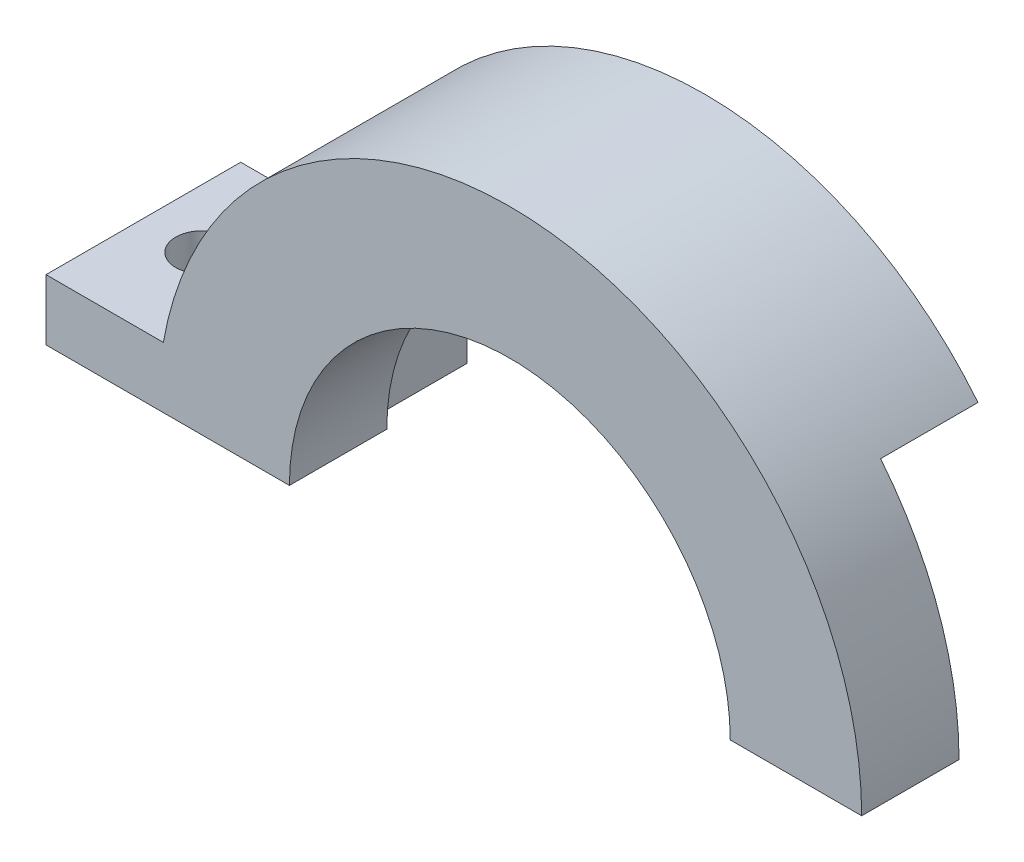
ISO-10303-21;
HEADER;
FILE_DESCRIPTION(('STEP AP214'),'2;1');
FILE_NAME('part.step','',(''),(''),'','','');
FILE_SCHEMA(('AUTOMOTIVE_DESIGN { 1 0 10303 214 1 1 1 1 }'));
ENDSEC;
DATA;
#1=APPLICATION_CONTEXT('core data for automotive mechanical design processes');
#2=APPLICATION_PROTOCOL_DEFINITION('international standard','automotive_design',2000,#1);
#3=PRODUCT_CONTEXT('',#1,'mechanical');
#4=PRODUCT('Part','Part','',(#3));
#5=PRODUCT_RELATED_PRODUCT_CATEGORY('part','',(#4));
#6=PRODUCT_DEFINITION_FORMATION('','',#4);
#7=PRODUCT_DEFINITION_CONTEXT('part definition',#1,'design');
#8=PRODUCT_DEFINITION('design','',#6,#7);
#9=PRODUCT_DEFINITION_SHAPE('','',#8);
#10=(LENGTH_UNIT() NAMED_UNIT(*) SI_UNIT(.MILLI.,.METRE.));
#11=(NAMED_UNIT(*) PLANE_ANGLE_UNIT() SI_UNIT($,.RADIAN.));
#12=(NAMED_UNIT(*) SI_UNIT($,.STERADIAN.) SOLID_ANGLE_UNIT());
#13=UNCERTAINTY_MEASURE_WITH_UNIT(LENGTH_MEASURE(1.E-05),#10,'distance_accuracy_value','');
#14=(GEOMETRIC_REPRESENTATION_CONTEXT(3) GLOBAL_UNCERTAINTY_ASSIGNED_CONTEXT((#13)) GLOBAL_UNIT_ASSIGNED_CONTEXT((#10,
#11,#12)) REPRESENTATION_CONTEXT('',''));
#15=CARTESIAN_POINT('',(0.,0.,0.));
#16=DIRECTION('',(0.,0.,1.));
#17=DIRECTION('',(1.,0.,0.));
#18=AXIS2_PLACEMENT_3D('',#15,#16,#17);
#19=CARTESIAN_POINT('',(0.,0.,8.));
#20=DIRECTION('',(0.,0.,-1.));
#21=DIRECTION('',(-1.,0.,0.));
#22=AXIS2_PLACEMENT_3D('',#19,#20,#21);
#23=CYLINDRICAL_SURFACE('',#22,28.9068116);
#24=CARTESIAN_POINT('',(0.,0.,8.));
#25=DIRECTION('',(0.,0.,1.));
#26=DIRECTION('',(1.,0.,0.));
#27=AXIS2_PLACEMENT_3D('',#24,#25,#26);
#28=CIRCLE('',#27,28.9068116);
#29=CARTESIAN_POINT('',(28.9068116,0.,8.));
#30=VERTEX_POINT('',#29);
#31=CARTESIAN_POINT('',(22.4647373497228,18.1917380336752,8.));
#32=VERTEX_POINT('',#31);
#33=EDGE_CURVE('E214',#30,#32,#28,.T.);
#34=ORIENTED_EDGE('',*,*,#33,.T.);
#35=DIRECTION('',(0.,0.,-1.));
#36=VECTOR('',#35,1.);
#37=CARTESIAN_POINT('',(22.4647373497228,18.1917380336752,8.));
#38=LINE('',#37,#36);
#39=CARTESIAN_POINT('',(22.4647373497228,18.1917380336752,0.));
#40=VERTEX_POINT('',#39);
#41=EDGE_CURVE('E210',#32,#40,#38,.T.);
#42=ORIENTED_EDGE('',*,*,#41,.T.);
#43=CARTESIAN_POINT('',(0.,0.,0.));
#44=DIRECTION('',(0.,0.,1.));
#45=DIRECTION('',(1.,0.,0.));
#46=AXIS2_PLACEMENT_3D('',#43,#44,#45);
#47=CIRCLE('',#46,28.9068116);
#48=CARTESIAN_POINT('',(-28.4711038928577,5.,0.));
#49=VERTEX_POINT('',#48);
#50=EDGE_CURVE('E107',#40,#49,#47,.T.);
#51=ORIENTED_EDGE('',*,*,#50,.T.);
#52=DIRECTION('',(0.,0.,1.));
#53=VECTOR('',#52,1.);
#54=CARTESIAN_POINT('',(-28.4711038928577,5.,0.));
#55=LINE('',#54,#53);
#56=CARTESIAN_POINT('',(-28.4711038928577,5.,16.));
#57=VERTEX_POINT('',#56);
#58=EDGE_CURVE('E176',#49,#57,#55,.T.);
#59=ORIENTED_EDGE('',*,*,#58,.T.);
#60=CARTESIAN_POINT('',(0.,0.,16.));
#61=DIRECTION('',(0.,0.,1.));
#62=DIRECTION('',(1.,0.,0.));
#63=AXIS2_PLACEMENT_3D('',#60,#61,#62);
#64=CIRCLE('',#63,28.9068116);
#65=CARTESIAN_POINT('',(28.9068116,0.,16.));
#66=VERTEX_POINT('',#65);
#67=EDGE_CURVE('E186',#66,#57,#64,.T.);
#68=ORIENTED_EDGE('',*,*,#67,.F.);
#69=DIRECTION('',(0.,0.,-1.));
#70=VECTOR('',#69,1.);
#71=CARTESIAN_POINT('',(28.9068116,0.,8.));
#72=LINE('',#71,#70);
#73=EDGE_CURVE('E86',#66,#30,#72,.T.);
#74=ORIENTED_EDGE('',*,*,#73,.T.);
#75=EDGE_LOOP('',(#34,#42,#51,#59,#68,#74));
#76=FACE_BOUND('',#75,.T.);
#77=ADVANCED_FACE('F39',(#76),#23,.T.);
#78=CARTESIAN_POINT('',(-28.9068116,0.,8.));
#79=DIRECTION('',(0.,1.,0.));
#80=DIRECTION('',(-1.,0.,0.));
#81=AXIS2_PLACEMENT_3D('',#78,#79,#80);
#82=PLANE('',#81);
#83=CARTESIAN_POINT('',(-33.2908319464288,0.,8.));
#84=DIRECTION('',(0.,1.,0.));
#85=DIRECTION('',(-1.,0.,0.));
#86=AXIS2_PLACEMENT_3D('',#83,#84,#85);
#87=CIRCLE('',#86,2.165);
#88=CARTESIAN_POINT('',(-35.4558319464288,0.,8.));
#89=VERTEX_POINT('',#88);
#90=EDGE_CURVE('E204',#89,#89,#87,.T.);
#91=ORIENTED_EDGE('',*,*,#90,.T.);
#92=EDGE_LOOP('',(#91));
#93=FACE_BOUND('',#92,.T.);
#94=DIRECTION('',(1.,0.,0.));
#95=VECTOR('',#94,1.);
#96=CARTESIAN_POINT('',(-28.9068116,0.,0.));
#97=LINE('',#96,#95);
#98=CARTESIAN_POINT('',(-38.11056,0.,0.));
#99=VERTEX_POINT('',#98);
#100=CARTESIAN_POINT('',(-19.5,0.,0.));
#101=VERTEX_POINT('',#100);
#102=EDGE_CURVE('E78',#99,#101,#97,.T.);
#103=ORIENTED_EDGE('',*,*,#102,.T.);
#104=DIRECTION('',(0.,0.,-1.));
#105=VECTOR('',#104,1.);
#106=CARTESIAN_POINT('',(-19.5,0.,8.));
#107=LINE('',#106,#105);
#108=CARTESIAN_POINT('',(-19.5,0.,8.));
#109=VERTEX_POINT('',#108);
#110=EDGE_CURVE('E11',#109,#101,#107,.T.);
#111=ORIENTED_EDGE('',*,*,#110,.F.);
#112=DIRECTION('',(1.,0.,0.));
#113=VECTOR('',#112,1.);
#114=CARTESIAN_POINT('',(-28.9068116,0.,8.));
#115=LINE('',#114,#113);
#116=CARTESIAN_POINT('',(-18.11056,0.,8.));
#117=VERTEX_POINT('',#116);
#118=EDGE_CURVE('E153',#109,#117,#115,.T.);
#119=ORIENTED_EDGE('',*,*,#118,.T.);
#120=DIRECTION('',(0.,0.,-1.));
#121=VECTOR('',#120,1.);
#122=CARTESIAN_POINT('',(-18.11056,0.,16.));
#123=LINE('',#122,#121);
#124=CARTESIAN_POINT('',(-18.11056,0.,16.));
#125=VERTEX_POINT('',#124);
#126=EDGE_CURVE('E155',#125,#117,#123,.T.);
#127=ORIENTED_EDGE('',*,*,#126,.F.);
#128=DIRECTION('',(1.,0.,0.));
#129=VECTOR('',#128,1.);
#130=CARTESIAN_POINT('',(-28.9068116,0.,16.));
#131=LINE('',#130,#129);
#132=CARTESIAN_POINT('',(-38.11056,0.,16.));
#133=VERTEX_POINT('',#132);
#134=EDGE_CURVE('E167',#133,#125,#131,.T.);
#135=ORIENTED_EDGE('',*,*,#134,.F.);
#136=DIRECTION('',(0.,0.,1.));
#137=VECTOR('',#136,1.);
#138=CARTESIAN_POINT('',(-38.11056,0.,0.));
#139=LINE('',#138,#137);
#140=EDGE_CURVE('E117',#99,#133,#139,.T.);
#141=ORIENTED_EDGE('',*,*,#140,.F.);
#142=EDGE_LOOP('',(#103,#111,#119,#127,#135,#141));
#143=FACE_BOUND('',#142,.T.);
#144=ADVANCED_FACE('F112',(#93,#143),#82,.F.);
#145=CARTESIAN_POINT('',(-19.5,13.8306052245697,8.));
#146=DIRECTION('',(-1.,0.,0.));
#147=DIRECTION('',(0.,0.,1.));
#148=AXIS2_PLACEMENT_3D('',#145,#146,#147);
#149=PLANE('',#148);
#150=DIRECTION('',(0.,1.,0.));
#151=VECTOR('',#150,1.);
#152=CARTESIAN_POINT('',(-19.5,13.8306052245697,0.));
#153=LINE('',#152,#151);
#154=CARTESIAN_POINT('',(-19.5,13.8306052245697,0.));
#155=VERTEX_POINT('',#154);
#156=EDGE_CURVE('E72',#101,#155,#153,.T.);
#157=ORIENTED_EDGE('',*,*,#156,.T.);
#158=DIRECTION('',(0.,0.,-1.));
#159=VECTOR('',#158,1.);
#160=CARTESIAN_POINT('',(-19.5,13.8306052245697,8.));
#161=LINE('',#160,#159);
#162=CARTESIAN_POINT('',(-19.5,13.8306052245697,8.));
#163=VERTEX_POINT('',#162);
#164=EDGE_CURVE('E46',#163,#155,#161,.T.);
#165=ORIENTED_EDGE('',*,*,#164,.F.);
#166=DIRECTION('',(0.,1.,0.));
#167=VECTOR('',#166,1.);
#168=CARTESIAN_POINT('',(-19.5,13.8306052245697,8.));
#169=LINE('',#168,#167);
#170=EDGE_CURVE('E90',#109,#163,#169,.T.);
#171=ORIENTED_EDGE('',*,*,#170,.F.);
#172=ORIENTED_EDGE('',*,*,#110,.T.);
#173=EDGE_LOOP('',(#157,#165,#171,#172));
#174=FACE_BOUND('',#173,.T.);
#175=ADVANCED_FACE('F73',(#174),#149,.F.);
#176=CARTESIAN_POINT('',(0.,0.,8.));
#177=DIRECTION('',(0.,0.,-1.));
#178=DIRECTION('',(-1.,0.,0.));
#179=AXIS2_PLACEMENT_3D('',#176,#177,#178);
#180=CYLINDRICAL_SURFACE('',#179,23.9068116);
#181=CARTESIAN_POINT('',(0.,0.,0.));
#182=DIRECTION('',(0.,0.,-1.));
#183=DIRECTION('',(1.,0.,0.));
#184=AXIS2_PLACEMENT_3D('',#181,#182,#183);
#185=CIRCLE('',#184,23.9068116);
#186=CARTESIAN_POINT('',(17.347099568461,16.4503427757538,0.));
#187=VERTEX_POINT('',#186);
#188=EDGE_CURVE('E77',#155,#187,#185,.T.);
#189=ORIENTED_EDGE('',*,*,#188,.T.);
#190=DIRECTION('',(0.,0.,-1.));
#191=VECTOR('',#190,1.);
#192=CARTESIAN_POINT('',(17.347099568461,16.4503427757538,8.));
#193=LINE('',#192,#191);
#194=CARTESIAN_POINT('',(17.347099568461,16.4503427757538,8.));
#195=VERTEX_POINT('',#194);
#196=EDGE_CURVE('E53',#195,#187,#193,.T.);
#197=ORIENTED_EDGE('',*,*,#196,.F.);
#198=CARTESIAN_POINT('',(0.,0.,8.));
#199=DIRECTION('',(0.,0.,-1.));
#200=DIRECTION('',(1.,0.,0.));
#201=AXIS2_PLACEMENT_3D('',#198,#199,#200);
#202=CIRCLE('',#201,23.9068116);
#203=EDGE_CURVE('E84',#163,#195,#202,.T.);
#204=ORIENTED_EDGE('',*,*,#203,.F.);
#205=ORIENTED_EDGE('',*,*,#164,.T.);
#206=EDGE_LOOP('',(#189,#197,#204,#205));
#207=FACE_BOUND('',#206,.T.);
#208=ADVANCED_FACE('F82',(#207),#180,.F.);
#209=CARTESIAN_POINT('',(23.9068116,0.,8.));
#210=DIRECTION('',(0.,1.,0.));
#211=DIRECTION('',(0.,0.,1.));
#212=AXIS2_PLACEMENT_3D('',#209,#210,#211);
#213=PLANE('',#212);
#214=DIRECTION('',(1.,0.,0.));
#215=VECTOR('',#214,1.);
#216=CARTESIAN_POINT('',(18.11056,0.,8.));
#217=LINE('',#216,#215);
#218=CARTESIAN_POINT('',(18.11056,0.,8.));
#219=VERTEX_POINT('',#218);
#220=EDGE_CURVE('E159',#219,#30,#217,.T.);
#221=ORIENTED_EDGE('',*,*,#220,.T.);
#222=ORIENTED_EDGE('',*,*,#73,.F.);
#223=DIRECTION('',(1.,0.,0.));
#224=VECTOR('',#223,1.);
#225=CARTESIAN_POINT('',(18.11056,0.,16.));
#226=LINE('',#225,#224);
#227=CARTESIAN_POINT('',(18.11056,0.,16.));
#228=VERTEX_POINT('',#227);
#229=EDGE_CURVE('E183',#228,#66,#226,.T.);
#230=ORIENTED_EDGE('',*,*,#229,.F.);
#231=DIRECTION('',(0.,0.,-1.));
#232=VECTOR('',#231,1.);
#233=CARTESIAN_POINT('',(18.11056,0.,16.));
#234=LINE('',#233,#232);
#235=EDGE_CURVE('E109',#228,#219,#234,.T.);
#236=ORIENTED_EDGE('',*,*,#235,.T.);
#237=EDGE_LOOP('',(#221,#222,#230,#236));
#238=FACE_BOUND('',#237,.T.);
#239=ADVANCED_FACE('F181',(#238),#213,.F.);
#240=CARTESIAN_POINT('',(0.,0.,0.));
#241=DIRECTION('',(0.,0.,1.));
#242=DIRECTION('',(1.,0.,0.));
#243=AXIS2_PLACEMENT_3D('',#240,#241,#242);
#244=PLANE('',#243);
#245=ORIENTED_EDGE('',*,*,#50,.F.);
#246=DIRECTION('',(0.946693876595628,0.322134605431242,0.));
#247=VECTOR('',#246,1.);
#248=CARTESIAN_POINT('',(17.347099568461,16.4503427757538,0.));
#249=LINE('',#248,#247);
#250=EDGE_CURVE('E89',#187,#40,#249,.T.);
#251=ORIENTED_EDGE('',*,*,#250,.F.);
#252=ORIENTED_EDGE('',*,*,#188,.F.);
#253=ORIENTED_EDGE('',*,*,#156,.F.);
#254=ORIENTED_EDGE('',*,*,#102,.F.);
#255=DIRECTION('',(0.,-1.,0.));
#256=VECTOR('',#255,1.);
#257=CARTESIAN_POINT('',(-38.11056,0.,0.));
#258=LINE('',#257,#256);
#259=CARTESIAN_POINT('',(-38.11056,5.,0.));
#260=VERTEX_POINT('',#259);
#261=EDGE_CURVE('E122',#260,#99,#258,.T.);
#262=ORIENTED_EDGE('',*,*,#261,.F.);
#263=DIRECTION('',(-1.,0.,0.));
#264=VECTOR('',#263,1.);
#265=CARTESIAN_POINT('',(-28.4711038928577,5.,0.));
#266=LINE('',#265,#264);
#267=EDGE_CURVE('E199',#49,#260,#266,.T.);
#268=ORIENTED_EDGE('',*,*,#267,.F.);
#269=EDGE_LOOP('',(#245,#251,#252,#253,#254,#262,#268));
#270=FACE_BOUND('',#269,.T.);
#271=ADVANCED_FACE('F88',(#270),#244,.F.);
#272=CARTESIAN_POINT('',(0.,0.,8.));
#273=DIRECTION('',(0.,0.,1.));
#274=DIRECTION('',(1.,0.,0.));
#275=AXIS2_PLACEMENT_3D('',#272,#273,#274);
#276=PLANE('',#275);
#277=ORIENTED_EDGE('',*,*,#203,.T.);
#278=DIRECTION('',(0.946693876595628,0.322134605431242,0.));
#279=VECTOR('',#278,1.);
#280=CARTESIAN_POINT('',(17.347099568461,16.4503427757538,8.));
#281=LINE('',#280,#279);
#282=EDGE_CURVE('E217',#195,#32,#281,.T.);
#283=ORIENTED_EDGE('',*,*,#282,.T.);
#284=ORIENTED_EDGE('',*,*,#33,.F.);
#285=ORIENTED_EDGE('',*,*,#220,.F.);
#286=CARTESIAN_POINT('',(0.,0.,8.));
#287=DIRECTION('',(0.,0.,-1.));
#288=DIRECTION('',(1.,0.,0.));
#289=AXIS2_PLACEMENT_3D('',#286,#287,#288);
#290=CIRCLE('',#289,18.11056);
#291=EDGE_CURVE('E164',#117,#219,#290,.T.);
#292=ORIENTED_EDGE('',*,*,#291,.F.);
#293=ORIENTED_EDGE('',*,*,#118,.F.);
#294=ORIENTED_EDGE('',*,*,#170,.T.);
#295=EDGE_LOOP('',(#277,#283,#284,#285,#292,#293,#294));
#296=FACE_BOUND('',#295,.T.);
#297=ADVANCED_FACE('F169',(#296),#276,.F.);
#298=CARTESIAN_POINT('',(0.,0.,16.));
#299=DIRECTION('',(0.,0.,-1.));
#300=DIRECTION('',(-1.,0.,0.));
#301=AXIS2_PLACEMENT_3D('',#298,#299,#300);
#302=CYLINDRICAL_SURFACE('',#301,18.11056);
#303=ORIENTED_EDGE('',*,*,#291,.T.);
#304=ORIENTED_EDGE('',*,*,#235,.F.);
#305=CARTESIAN_POINT('',(0.,0.,16.));
#306=DIRECTION('',(0.,0.,-1.));
#307=DIRECTION('',(1.,0.,0.));
#308=AXIS2_PLACEMENT_3D('',#305,#306,#307);
#309=CIRCLE('',#308,18.11056);
#310=EDGE_CURVE('E158',#125,#228,#309,.T.);
#311=ORIENTED_EDGE('',*,*,#310,.F.);
#312=ORIENTED_EDGE('',*,*,#126,.T.);
#313=EDGE_LOOP('',(#303,#304,#311,#312));
#314=FACE_BOUND('',#313,.T.);
#315=ADVANCED_FACE('F162',(#314),#302,.F.);
#316=CARTESIAN_POINT('',(0.,0.,16.));
#317=DIRECTION('',(0.,0.,1.));
#318=DIRECTION('',(1.,0.,0.));
#319=AXIS2_PLACEMENT_3D('',#316,#317,#318);
#320=PLANE('',#319);
#321=ORIENTED_EDGE('',*,*,#310,.T.);
#322=ORIENTED_EDGE('',*,*,#229,.T.);
#323=ORIENTED_EDGE('',*,*,#67,.T.);
#324=DIRECTION('',(-1.,0.,0.));
#325=VECTOR('',#324,1.);
#326=CARTESIAN_POINT('',(-28.4711038928577,5.,16.));
#327=LINE('',#326,#325);
#328=CARTESIAN_POINT('',(-38.11056,5.,16.));
#329=VERTEX_POINT('',#328);
#330=EDGE_CURVE('E194',#57,#329,#327,.T.);
#331=ORIENTED_EDGE('',*,*,#330,.T.);
#332=DIRECTION('',(0.,-1.,0.));
#333=VECTOR('',#332,1.);
#334=CARTESIAN_POINT('',(-38.11056,0.,16.));
#335=LINE('',#334,#333);
#336=EDGE_CURVE('E202',#329,#133,#335,.T.);
#337=ORIENTED_EDGE('',*,*,#336,.T.);
#338=ORIENTED_EDGE('',*,*,#134,.T.);
#339=EDGE_LOOP('',(#321,#322,#323,#331,#337,#338));
#340=FACE_BOUND('',#339,.T.);
#341=ADVANCED_FACE('F188',(#340),#320,.T.);
#342=CARTESIAN_POINT('',(-38.11056,0.,0.));
#343=DIRECTION('',(-1.,0.,0.));
#344=DIRECTION('',(0.,0.,1.));
#345=AXIS2_PLACEMENT_3D('',#342,#343,#344);
#346=PLANE('',#345);
#347=ORIENTED_EDGE('',*,*,#336,.F.);
#348=DIRECTION('',(0.,0.,1.));
#349=VECTOR('',#348,1.);
#350=CARTESIAN_POINT('',(-38.11056,5.,0.));
#351=LINE('',#350,#349);
#352=EDGE_CURVE('E173',#260,#329,#351,.T.);
#353=ORIENTED_EDGE('',*,*,#352,.F.);
#354=ORIENTED_EDGE('',*,*,#261,.T.);
#355=ORIENTED_EDGE('',*,*,#140,.T.);
#356=EDGE_LOOP('',(#347,#353,#354,#355));
#357=FACE_BOUND('',#356,.T.);
#358=ADVANCED_FACE('F225',(#357),#346,.T.);
#359=CARTESIAN_POINT('',(-28.4711038928577,5.,0.));
#360=DIRECTION('',(0.,1.,0.));
#361=DIRECTION('',(-1.,0.,0.));
#362=AXIS2_PLACEMENT_3D('',#359,#360,#361);
#363=PLANE('',#362);
#364=CARTESIAN_POINT('',(-33.2908319464288,5.,8.));
#365=DIRECTION('',(0.,1.,0.));
#366=DIRECTION('',(-1.,0.,0.));
#367=AXIS2_PLACEMENT_3D('',#364,#365,#366);
#368=CIRCLE('',#367,2.165);
#369=CARTESIAN_POINT('',(-35.4558319464288,5.,8.));
#370=VERTEX_POINT('',#369);
#371=EDGE_CURVE('E207',#370,#370,#368,.T.);
#372=ORIENTED_EDGE('',*,*,#371,.F.);
#373=EDGE_LOOP('',(#372));
#374=FACE_BOUND('',#373,.T.);
#375=ORIENTED_EDGE('',*,*,#330,.F.);
#376=ORIENTED_EDGE('',*,*,#58,.F.);
#377=ORIENTED_EDGE('',*,*,#267,.T.);
#378=ORIENTED_EDGE('',*,*,#352,.T.);
#379=EDGE_LOOP('',(#375,#376,#377,#378));
#380=FACE_BOUND('',#379,.T.);
#381=ADVANCED_FACE('F222',(#374,#380),#363,.T.);
#382=CARTESIAN_POINT('',(-33.2908319464288,0.,8.));
#383=DIRECTION('',(0.,1.,0.));
#384=DIRECTION('',(-1.,0.,0.));
#385=AXIS2_PLACEMENT_3D('',#382,#383,#384);
#386=CYLINDRICAL_SURFACE('',#385,2.165);
#387=ORIENTED_EDGE('',*,*,#90,.F.);
#388=EDGE_LOOP('',(#387));
#389=FACE_BOUND('',#388,.T.);
#390=ORIENTED_EDGE('',*,*,#371,.T.);
#391=EDGE_LOOP('',(#390));
#392=FACE_BOUND('',#391,.T.);
#393=ADVANCED_FACE('F232',(#389,#392),#386,.F.);
#394=CARTESIAN_POINT('',(17.347099568461,16.4503427757538,8.));
#395=DIRECTION('',(-0.322134605431242,0.946693876595628,0.));
#396=DIRECTION('',(-0.946693876595628,-0.322134605431242,0.));
#397=AXIS2_PLACEMENT_3D('',#394,#395,#396);
#398=PLANE('',#397);
#399=ORIENTED_EDGE('',*,*,#282,.F.);
#400=ORIENTED_EDGE('',*,*,#196,.T.);
#401=ORIENTED_EDGE('',*,*,#250,.T.);
#402=ORIENTED_EDGE('',*,*,#41,.F.);
#403=EDGE_LOOP('',(#399,#400,#401,#402));
#404=FACE_BOUND('',#403,.T.);
#405=ADVANCED_FACE('F292',(#404),#398,.F.);
#406=CLOSED_SHELL('',(#77,#144,#175,#208,#239,#271,#297,#315,#341,#358,#381,#393,#405));
#407=MANIFOLD_SOLID_BREP('B2',#406);
#408=ADVANCED_BREP_SHAPE_REPRESENTATION('',(#18,#407),#14);
#409=SHAPE_DEFINITION_REPRESENTATION(#9,#408);
ENDSEC;
END-ISO-10303-21;
